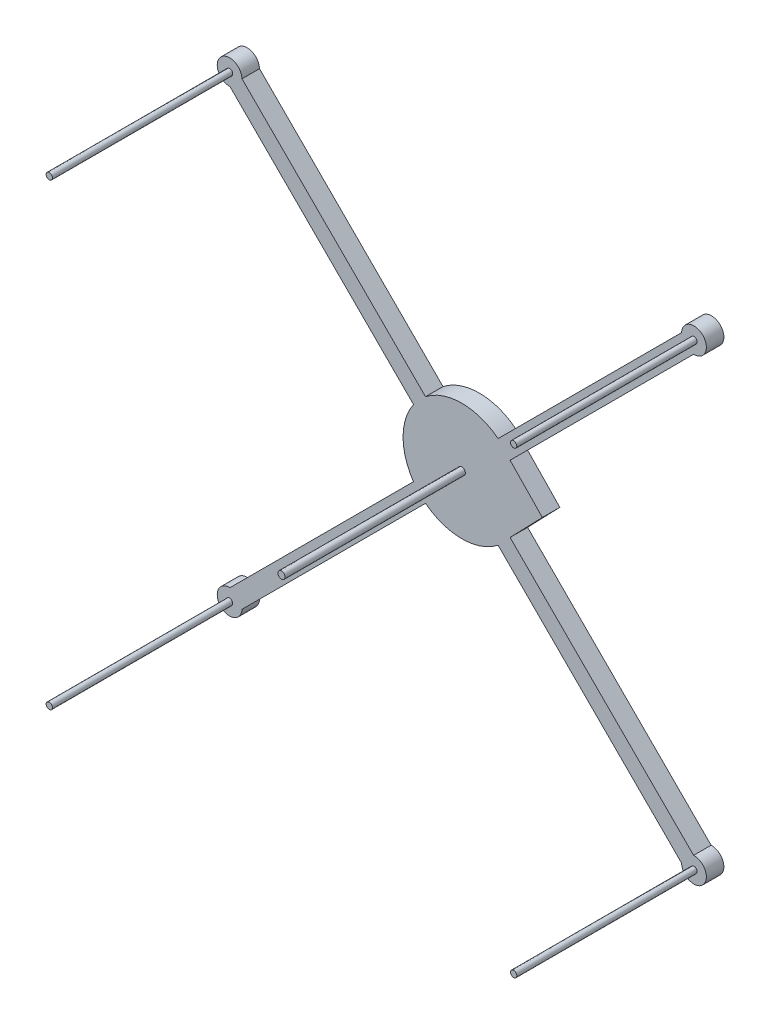
ISO-10303-21;
HEADER;
FILE_DESCRIPTION(('STEP AP214'),'2;1');
FILE_NAME('part.step','',(''),(''),'','','');
FILE_SCHEMA(('AUTOMOTIVE_DESIGN { 1 0 10303 214 1 1 1 1 }'));
ENDSEC;
DATA;
#1=APPLICATION_CONTEXT('core data for automotive mechanical design processes');
#2=APPLICATION_PROTOCOL_DEFINITION('international standard','automotive_design',2000,#1);
#3=PRODUCT_CONTEXT('',#1,'mechanical');
#4=PRODUCT('Part','Part','',(#3));
#5=PRODUCT_RELATED_PRODUCT_CATEGORY('part','',(#4));
#6=PRODUCT_DEFINITION_FORMATION('','',#4);
#7=PRODUCT_DEFINITION_CONTEXT('part definition',#1,'design');
#8=PRODUCT_DEFINITION('design','',#6,#7);
#9=PRODUCT_DEFINITION_SHAPE('','',#8);
#10=(LENGTH_UNIT() NAMED_UNIT(*) SI_UNIT(.MILLI.,.METRE.));
#11=(NAMED_UNIT(*) PLANE_ANGLE_UNIT() SI_UNIT($,.RADIAN.));
#12=(NAMED_UNIT(*) SI_UNIT($,.STERADIAN.) SOLID_ANGLE_UNIT());
#13=UNCERTAINTY_MEASURE_WITH_UNIT(LENGTH_MEASURE(1.E-05),#10,'distance_accuracy_value','');
#14=(GEOMETRIC_REPRESENTATION_CONTEXT(3) GLOBAL_UNCERTAINTY_ASSIGNED_CONTEXT((#13)) GLOBAL_UNIT_ASSIGNED_CONTEXT((#10,
#11,#12)) REPRESENTATION_CONTEXT('',''));
#15=CARTESIAN_POINT('',(0.,0.,0.));
#16=DIRECTION('',(0.,0.,1.));
#17=DIRECTION('',(1.,0.,0.));
#18=AXIS2_PLACEMENT_3D('',#15,#16,#17);
#19=CARTESIAN_POINT('',(0.,0.,10.));
#20=DIRECTION('',(0.,0.,-1.));
#21=DIRECTION('',(-1.,0.,0.));
#22=AXIS2_PLACEMENT_3D('',#19,#20,#21);
#23=CYLINDRICAL_SURFACE('',#22,33.5467251566115);
#24=CARTESIAN_POINT('',(0.,0.,0.));
#25=DIRECTION('',(0.,0.,1.));
#26=DIRECTION('',(1.,0.,0.));
#27=AXIS2_PLACEMENT_3D('',#24,#25,#26);
#28=CIRCLE('',#27,33.5467251566115);
#29=CARTESIAN_POINT('',(-27.5804067693425,19.0972231272203,0.));
#30=VERTEX_POINT('',#29);
#31=CARTESIAN_POINT('',(-27.5804067693425,-19.0972231272203,0.));
#32=VERTEX_POINT('',#31);
#33=EDGE_CURVE('E195',#30,#32,#28,.T.);
#34=ORIENTED_EDGE('',*,*,#33,.T.);
#35=DIRECTION('',(0.,0.,-1.));
#36=VECTOR('',#35,1.);
#37=CARTESIAN_POINT('',(-27.5804067693425,-19.0972231272203,10.));
#38=LINE('',#37,#36);
#39=CARTESIAN_POINT('',(-27.5804067693425,-19.0972231272203,10.));
#40=VERTEX_POINT('',#39);
#41=EDGE_CURVE('E13',#40,#32,#38,.T.);
#42=ORIENTED_EDGE('',*,*,#41,.F.);
#43=CARTESIAN_POINT('',(0.,0.,10.));
#44=DIRECTION('',(0.,0.,1.));
#45=DIRECTION('',(1.,0.,0.));
#46=AXIS2_PLACEMENT_3D('',#43,#44,#45);
#47=CIRCLE('',#46,33.5467251566115);
#48=CARTESIAN_POINT('',(-27.5804067693425,19.0972231272203,10.));
#49=VERTEX_POINT('',#48);
#50=EDGE_CURVE('E228',#49,#40,#47,.T.);
#51=ORIENTED_EDGE('',*,*,#50,.F.);
#52=DIRECTION('',(0.,0.,-1.));
#53=VECTOR('',#52,1.);
#54=CARTESIAN_POINT('',(-27.5804067693425,19.0972231272203,10.));
#55=LINE('',#54,#53);
#56=EDGE_CURVE('E191',#49,#30,#55,.T.);
#57=ORIENTED_EDGE('',*,*,#56,.T.);
#58=EDGE_LOOP('',(#34,#42,#51,#57));
#59=FACE_BOUND('',#58,.T.);
#60=ADVANCED_FACE('F45',(#59),#23,.T.);
#61=CARTESIAN_POINT('',(-27.5804067693425,-19.0972231272203,10.));
#62=DIRECTION('',(0.707106781186548,-0.707106781186548,0.));
#63=DIRECTION('',(0.707106781186548,0.707106781186548,0.));
#64=AXIS2_PLACEMENT_3D('',#61,#62,#63);
#65=PLANE('',#64);
#66=DIRECTION('',(-0.707106781186547,-0.707106781186547,0.));
#67=VECTOR('',#66,1.);
#68=CARTESIAN_POINT('',(-27.5804067693425,-19.0972231272203,0.));
#69=LINE('',#68,#67);
#70=CARTESIAN_POINT('',(-132.411700909868,-123.928517267745,0.));
#71=VERTEX_POINT('',#70);
#72=EDGE_CURVE('E198',#32,#71,#69,.T.);
#73=ORIENTED_EDGE('',*,*,#72,.T.);
#74=DIRECTION('',(0.,0.,-1.));
#75=VECTOR('',#74,1.);
#76=CARTESIAN_POINT('',(-132.411700909868,-123.928517267745,10.));
#77=LINE('',#76,#75);
#78=CARTESIAN_POINT('',(-132.411700909868,-123.928517267745,10.));
#79=VERTEX_POINT('',#78);
#80=EDGE_CURVE('E53',#79,#71,#77,.T.);
#81=ORIENTED_EDGE('',*,*,#80,.F.);
#82=DIRECTION('',(-0.707106781186547,-0.707106781186547,0.));
#83=VECTOR('',#82,1.);
#84=CARTESIAN_POINT('',(-27.5804067693425,-19.0972231272203,10.));
#85=LINE('',#84,#83);
#86=EDGE_CURVE('E131',#40,#79,#85,.T.);
#87=ORIENTED_EDGE('',*,*,#86,.F.);
#88=ORIENTED_EDGE('',*,*,#41,.T.);
#89=EDGE_LOOP('',(#73,#81,#87,#88));
#90=FACE_BOUND('',#89,.T.);
#91=ADVANCED_FACE('F332',(#90),#65,.F.);
#92=CARTESIAN_POINT('',(-132.621345525346,-130.996476600905,10.));
#93=DIRECTION('',(0.,0.,-1.));
#94=DIRECTION('',(-1.,0.,0.));
#95=AXIS2_PLACEMENT_3D('',#92,#93,#94);
#96=CYLINDRICAL_SURFACE('',#95,7.07106781186562);
#97=CARTESIAN_POINT('',(-132.621345525346,-130.996476600905,0.));
#98=DIRECTION('',(0.,0.,1.));
#99=DIRECTION('',(1.,0.,0.));
#100=AXIS2_PLACEMENT_3D('',#97,#98,#99);
#101=CIRCLE('',#100,7.07106781186562);
#102=CARTESIAN_POINT('',(-125.553579230032,-131.212531211641,0.));
#103=VERTEX_POINT('',#102);
#104=EDGE_CURVE('E201',#71,#103,#101,.T.);
#105=ORIENTED_EDGE('',*,*,#104,.T.);
#106=DIRECTION('',(0.,0.,-1.));
#107=VECTOR('',#106,1.);
#108=CARTESIAN_POINT('',(-125.553579230032,-131.212531211641,10.));
#109=LINE('',#108,#107);
#110=CARTESIAN_POINT('',(-125.553579230032,-131.212531211641,10.));
#111=VERTEX_POINT('',#110);
#112=EDGE_CURVE('E262',#111,#103,#109,.T.);
#113=ORIENTED_EDGE('',*,*,#112,.F.);
#114=CARTESIAN_POINT('',(-132.621345525346,-130.996476600905,10.));
#115=DIRECTION('',(0.,0.,1.));
#116=DIRECTION('',(1.,0.,0.));
#117=AXIS2_PLACEMENT_3D('',#114,#115,#116);
#118=CIRCLE('',#117,7.07106781186562);
#119=EDGE_CURVE('E270',#79,#111,#118,.T.);
#120=ORIENTED_EDGE('',*,*,#119,.F.);
#121=ORIENTED_EDGE('',*,*,#80,.T.);
#122=EDGE_LOOP('',(#105,#113,#120,#121));
#123=FACE_BOUND('',#122,.T.);
#124=ADVANCED_FACE('F268',(#123),#96,.T.);
#125=CARTESIAN_POINT('',(-20.7222850895072,-26.3812370711159,10.));
#126=DIRECTION('',(-0.707106781186549,0.707106781186546,0.));
#127=DIRECTION('',(-0.707106781186546,-0.707106781186549,0.));
#128=AXIS2_PLACEMENT_3D('',#125,#126,#127);
#129=PLANE('',#128);
#130=DIRECTION('',(0.707106781186546,0.707106781186549,0.));
#131=VECTOR('',#130,1.);
#132=CARTESIAN_POINT('',(-20.7222850895072,-26.3812370711159,0.));
#133=LINE('',#132,#131);
#134=CARTESIAN_POINT('',(-20.7222850895072,-26.3812370711159,0.));
#135=VERTEX_POINT('',#134);
#136=EDGE_CURVE('E203',#103,#135,#133,.T.);
#137=ORIENTED_EDGE('',*,*,#136,.T.);
#138=DIRECTION('',(0.,0.,-1.));
#139=VECTOR('',#138,1.);
#140=CARTESIAN_POINT('',(-20.7222850895072,-26.3812370711159,10.));
#141=LINE('',#140,#139);
#142=CARTESIAN_POINT('',(-20.7222850895072,-26.3812370711159,10.));
#143=VERTEX_POINT('',#142);
#144=EDGE_CURVE('E259',#143,#135,#141,.T.);
#145=ORIENTED_EDGE('',*,*,#144,.F.);
#146=DIRECTION('',(0.707106781186546,0.707106781186549,0.));
#147=VECTOR('',#146,1.);
#148=CARTESIAN_POINT('',(-20.7222850895072,-26.3812370711159,10.));
#149=LINE('',#148,#147);
#150=EDGE_CURVE('E288',#111,#143,#149,.T.);
#151=ORIENTED_EDGE('',*,*,#150,.F.);
#152=ORIENTED_EDGE('',*,*,#112,.T.);
#153=EDGE_LOOP('',(#137,#145,#151,#152));
#154=FACE_BOUND('',#153,.T.);
#155=ADVANCED_FACE('F279',(#154),#129,.F.);
#156=CARTESIAN_POINT('',(0.,0.,10.));
#157=DIRECTION('',(0.,0.,-1.));
#158=DIRECTION('',(-1.,0.,0.));
#159=AXIS2_PLACEMENT_3D('',#156,#157,#158);
#160=CYLINDRICAL_SURFACE('',#159,33.5467251566115);
#161=CARTESIAN_POINT('',(0.,0.,0.));
#162=DIRECTION('',(0.,0.,1.));
#163=DIRECTION('',(1.,0.,0.));
#164=AXIS2_PLACEMENT_3D('',#161,#162,#163);
#165=CIRCLE('',#164,33.5467251566115);
#166=CARTESIAN_POINT('',(20.7222850895072,-26.3812370711159,0.));
#167=VERTEX_POINT('',#166);
#168=EDGE_CURVE('E205',#135,#167,#165,.T.);
#169=ORIENTED_EDGE('',*,*,#168,.T.);
#170=DIRECTION('',(0.,0.,-1.));
#171=VECTOR('',#170,1.);
#172=CARTESIAN_POINT('',(20.7222850895072,-26.3812370711159,10.));
#173=LINE('',#172,#171);
#174=CARTESIAN_POINT('',(20.7222850895072,-26.3812370711159,10.));
#175=VERTEX_POINT('',#174);
#176=EDGE_CURVE('E256',#175,#167,#173,.T.);
#177=ORIENTED_EDGE('',*,*,#176,.F.);
#178=CARTESIAN_POINT('',(0.,0.,10.));
#179=DIRECTION('',(0.,0.,1.));
#180=DIRECTION('',(1.,0.,0.));
#181=AXIS2_PLACEMENT_3D('',#178,#179,#180);
#182=CIRCLE('',#181,33.5467251566115);
#183=EDGE_CURVE('E285',#143,#175,#182,.T.);
#184=ORIENTED_EDGE('',*,*,#183,.F.);
#185=ORIENTED_EDGE('',*,*,#144,.T.);
#186=EDGE_LOOP('',(#169,#177,#184,#185));
#187=FACE_BOUND('',#186,.T.);
#188=ADVANCED_FACE('F283',(#187),#160,.T.);
#189=CARTESIAN_POINT('',(20.7222850895072,-26.3812370711159,10.));
#190=DIRECTION('',(0.707106781186549,0.707106781186546,0.));
#191=DIRECTION('',(-0.707106781186546,0.707106781186549,0.));
#192=AXIS2_PLACEMENT_3D('',#189,#190,#191);
#193=PLANE('',#192);
#194=DIRECTION('',(0.707106781186546,-0.707106781186549,0.));
#195=VECTOR('',#194,1.);
#196=CARTESIAN_POINT('',(20.7222850895072,-26.3812370711159,0.));
#197=LINE('',#196,#195);
#198=CARTESIAN_POINT('',(125.553579230032,-131.212531211641,0.));
#199=VERTEX_POINT('',#198);
#200=EDGE_CURVE('E207',#167,#199,#197,.T.);
#201=ORIENTED_EDGE('',*,*,#200,.T.);
#202=DIRECTION('',(0.,0.,-1.));
#203=VECTOR('',#202,1.);
#204=CARTESIAN_POINT('',(125.553579230032,-131.212531211641,10.));
#205=LINE('',#204,#203);
#206=CARTESIAN_POINT('',(125.553579230032,-131.212531211641,10.));
#207=VERTEX_POINT('',#206);
#208=EDGE_CURVE('E253',#207,#199,#205,.T.);
#209=ORIENTED_EDGE('',*,*,#208,.F.);
#210=DIRECTION('',(0.707106781186546,-0.707106781186549,0.));
#211=VECTOR('',#210,1.);
#212=CARTESIAN_POINT('',(20.7222850895072,-26.3812370711159,10.));
#213=LINE('',#212,#211);
#214=EDGE_CURVE('E287',#175,#207,#213,.T.);
#215=ORIENTED_EDGE('',*,*,#214,.F.);
#216=ORIENTED_EDGE('',*,*,#176,.T.);
#217=EDGE_LOOP('',(#201,#209,#215,#216));
#218=FACE_BOUND('',#217,.T.);
#219=ADVANCED_FACE('F345',(#218),#193,.F.);
#220=CARTESIAN_POINT('',(132.621345525346,-130.996476600905,10.));
#221=DIRECTION('',(0.,0.,-1.));
#222=DIRECTION('',(-1.,0.,0.));
#223=AXIS2_PLACEMENT_3D('',#220,#221,#222);
#224=CYLINDRICAL_SURFACE('',#223,7.07106781186562);
#225=CARTESIAN_POINT('',(132.621345525346,-130.996476600905,0.));
#226=DIRECTION('',(0.,0.,1.));
#227=DIRECTION('',(-1.,0.,0.));
#228=AXIS2_PLACEMENT_3D('',#225,#226,#227);
#229=CIRCLE('',#228,7.07106781186562);
#230=CARTESIAN_POINT('',(132.411700909868,-123.928517267745,0.));
#231=VERTEX_POINT('',#230);
#232=EDGE_CURVE('E209',#199,#231,#229,.T.);
#233=ORIENTED_EDGE('',*,*,#232,.T.);
#234=DIRECTION('',(0.,0.,-1.));
#235=VECTOR('',#234,1.);
#236=CARTESIAN_POINT('',(132.411700909868,-123.928517267745,10.));
#237=LINE('',#236,#235);
#238=CARTESIAN_POINT('',(132.411700909868,-123.928517267745,10.));
#239=VERTEX_POINT('',#238);
#240=EDGE_CURVE('E250',#239,#231,#237,.T.);
#241=ORIENTED_EDGE('',*,*,#240,.F.);
#242=CARTESIAN_POINT('',(132.621345525346,-130.996476600905,10.));
#243=DIRECTION('',(0.,0.,1.));
#244=DIRECTION('',(-1.,0.,0.));
#245=AXIS2_PLACEMENT_3D('',#242,#243,#244);
#246=CIRCLE('',#245,7.07106781186562);
#247=EDGE_CURVE('E290',#207,#239,#246,.T.);
#248=ORIENTED_EDGE('',*,*,#247,.F.);
#249=ORIENTED_EDGE('',*,*,#208,.T.);
#250=EDGE_LOOP('',(#233,#241,#248,#249));
#251=FACE_BOUND('',#250,.T.);
#252=ADVANCED_FACE('F348',(#251),#224,.T.);
#253=CARTESIAN_POINT('',(27.5804067693425,-19.0972231272203,10.));
#254=DIRECTION('',(-0.707106781186548,-0.707106781186548,0.));
#255=DIRECTION('',(0.707106781186548,-0.707106781186548,0.));
#256=AXIS2_PLACEMENT_3D('',#253,#254,#255);
#257=PLANE('',#256);
#258=DIRECTION('',(-0.707106781186547,0.707106781186547,0.));
#259=VECTOR('',#258,1.);
#260=CARTESIAN_POINT('',(27.5804067693425,-19.0972231272203,0.));
#261=LINE('',#260,#259);
#262=CARTESIAN_POINT('',(27.5804067693425,-19.0972231272203,0.));
#263=VERTEX_POINT('',#262);
#264=EDGE_CURVE('E211',#231,#263,#261,.T.);
#265=ORIENTED_EDGE('',*,*,#264,.T.);
#266=DIRECTION('',(0.,0.,-1.));
#267=VECTOR('',#266,1.);
#268=CARTESIAN_POINT('',(27.5804067693425,-19.0972231272203,10.));
#269=LINE('',#268,#267);
#270=CARTESIAN_POINT('',(27.5804067693425,-19.0972231272203,10.));
#271=VERTEX_POINT('',#270);
#272=EDGE_CURVE('E247',#271,#263,#269,.T.);
#273=ORIENTED_EDGE('',*,*,#272,.F.);
#274=DIRECTION('',(-0.707106781186547,0.707106781186547,0.));
#275=VECTOR('',#274,1.);
#276=CARTESIAN_POINT('',(27.5804067693425,-19.0972231272203,10.));
#277=LINE('',#276,#275);
#278=EDGE_CURVE('E296',#239,#271,#277,.T.);
#279=ORIENTED_EDGE('',*,*,#278,.F.);
#280=ORIENTED_EDGE('',*,*,#240,.T.);
#281=EDGE_LOOP('',(#265,#273,#279,#280));
#282=FACE_BOUND('',#281,.T.);
#283=ADVANCED_FACE('F352',(#282),#257,.F.);
#284=CARTESIAN_POINT('',(46.0050037511092,0.,10.));
#285=DIRECTION('',(-0.719666942195826,0.694319445435967,0.));
#286=DIRECTION('',(-0.694319445435967,-0.719666942195826,0.));
#287=AXIS2_PLACEMENT_3D('',#284,#285,#286);
#288=PLANE('',#287);
#289=DIRECTION('',(0.694319445435967,0.719666942195827,0.));
#290=VECTOR('',#289,1.);
#291=CARTESIAN_POINT('',(46.0050037511092,0.,0.));
#292=LINE('',#291,#290);
#293=CARTESIAN_POINT('',(46.0050037511092,0.,0.));
#294=VERTEX_POINT('',#293);
#295=EDGE_CURVE('E213',#263,#294,#292,.T.);
#296=ORIENTED_EDGE('',*,*,#295,.T.);
#297=DIRECTION('',(0.,0.,-1.));
#298=VECTOR('',#297,1.);
#299=CARTESIAN_POINT('',(46.0050037511092,0.,10.));
#300=LINE('',#299,#298);
#301=CARTESIAN_POINT('',(46.0050037511092,0.,10.));
#302=VERTEX_POINT('',#301);
#303=EDGE_CURVE('E244',#302,#294,#300,.T.);
#304=ORIENTED_EDGE('',*,*,#303,.F.);
#305=DIRECTION('',(0.694319445435967,0.719666942195827,0.));
#306=VECTOR('',#305,1.);
#307=CARTESIAN_POINT('',(46.0050037511092,0.,10.));
#308=LINE('',#307,#306);
#309=EDGE_CURVE('E298',#271,#302,#308,.T.);
#310=ORIENTED_EDGE('',*,*,#309,.F.);
#311=ORIENTED_EDGE('',*,*,#272,.T.);
#312=EDGE_LOOP('',(#296,#304,#310,#311));
#313=FACE_BOUND('',#312,.T.);
#314=ADVANCED_FACE('F356',(#313),#288,.F.);
#315=CARTESIAN_POINT('',(27.5804067693425,19.0972231272203,10.));
#316=DIRECTION('',(-0.719666942195826,-0.694319445435967,0.));
#317=DIRECTION('',(0.694319445435967,-0.719666942195826,0.));
#318=AXIS2_PLACEMENT_3D('',#315,#316,#317);
#319=PLANE('',#318);
#320=DIRECTION('',(-0.694319445435967,0.719666942195827,0.));
#321=VECTOR('',#320,1.);
#322=CARTESIAN_POINT('',(27.5804067693425,19.0972231272203,0.));
#323=LINE('',#322,#321);
#324=CARTESIAN_POINT('',(27.5804067693425,19.0972231272203,0.));
#325=VERTEX_POINT('',#324);
#326=EDGE_CURVE('E215',#294,#325,#323,.T.);
#327=ORIENTED_EDGE('',*,*,#326,.T.);
#328=DIRECTION('',(0.,0.,-1.));
#329=VECTOR('',#328,1.);
#330=CARTESIAN_POINT('',(27.5804067693425,19.0972231272203,10.));
#331=LINE('',#330,#329);
#332=CARTESIAN_POINT('',(27.5804067693425,19.0972231272203,10.));
#333=VERTEX_POINT('',#332);
#334=EDGE_CURVE('E241',#333,#325,#331,.T.);
#335=ORIENTED_EDGE('',*,*,#334,.F.);
#336=DIRECTION('',(-0.694319445435967,0.719666942195827,0.));
#337=VECTOR('',#336,1.);
#338=CARTESIAN_POINT('',(27.5804067693425,19.0972231272203,10.));
#339=LINE('',#338,#337);
#340=EDGE_CURVE('E300',#302,#333,#339,.T.);
#341=ORIENTED_EDGE('',*,*,#340,.F.);
#342=ORIENTED_EDGE('',*,*,#303,.T.);
#343=EDGE_LOOP('',(#327,#335,#341,#342));
#344=FACE_BOUND('',#343,.T.);
#345=ADVANCED_FACE('F360',(#344),#319,.F.);
#346=CARTESIAN_POINT('',(27.5804067693425,19.0972231272203,10.));
#347=DIRECTION('',(-0.707106781186548,0.707106781186548,0.));
#348=DIRECTION('',(-0.707106781186548,-0.707106781186548,0.));
#349=AXIS2_PLACEMENT_3D('',#346,#347,#348);
#350=PLANE('',#349);
#351=DIRECTION('',(0.707106781186547,0.707106781186547,0.));
#352=VECTOR('',#351,1.);
#353=CARTESIAN_POINT('',(27.5804067693425,19.0972231272203,0.));
#354=LINE('',#353,#352);
#355=CARTESIAN_POINT('',(132.411700909868,123.928517267745,0.));
#356=VERTEX_POINT('',#355);
#357=EDGE_CURVE('E217',#325,#356,#354,.T.);
#358=ORIENTED_EDGE('',*,*,#357,.T.);
#359=DIRECTION('',(0.,0.,-1.));
#360=VECTOR('',#359,1.);
#361=CARTESIAN_POINT('',(132.411700909868,123.928517267745,10.));
#362=LINE('',#361,#360);
#363=CARTESIAN_POINT('',(132.411700909868,123.928517267745,10.));
#364=VERTEX_POINT('',#363);
#365=EDGE_CURVE('E238',#364,#356,#362,.T.);
#366=ORIENTED_EDGE('',*,*,#365,.F.);
#367=DIRECTION('',(0.707106781186547,0.707106781186547,0.));
#368=VECTOR('',#367,1.);
#369=CARTESIAN_POINT('',(27.5804067693425,19.0972231272203,10.));
#370=LINE('',#369,#368);
#371=EDGE_CURVE('E302',#333,#364,#370,.T.);
#372=ORIENTED_EDGE('',*,*,#371,.F.);
#373=ORIENTED_EDGE('',*,*,#334,.T.);
#374=EDGE_LOOP('',(#358,#366,#372,#373));
#375=FACE_BOUND('',#374,.T.);
#376=ADVANCED_FACE('F364',(#375),#350,.F.);
#377=CARTESIAN_POINT('',(132.621345525346,130.996476600905,10.));
#378=DIRECTION('',(0.,0.,-1.));
#379=DIRECTION('',(-1.,0.,0.));
#380=AXIS2_PLACEMENT_3D('',#377,#378,#379);
#381=CYLINDRICAL_SURFACE('',#380,7.07106781186562);
#382=CARTESIAN_POINT('',(132.621345525346,130.996476600905,0.));
#383=DIRECTION('',(0.,0.,1.));
#384=DIRECTION('',(1.,0.,0.));
#385=AXIS2_PLACEMENT_3D('',#382,#383,#384);
#386=CIRCLE('',#385,7.07106781186562);
#387=CARTESIAN_POINT('',(125.553579230032,131.212531211641,0.));
#388=VERTEX_POINT('',#387);
#389=EDGE_CURVE('E219',#356,#388,#386,.T.);
#390=ORIENTED_EDGE('',*,*,#389,.T.);
#391=DIRECTION('',(0.,0.,-1.));
#392=VECTOR('',#391,1.);
#393=CARTESIAN_POINT('',(125.553579230032,131.212531211641,10.));
#394=LINE('',#393,#392);
#395=CARTESIAN_POINT('',(125.553579230032,131.212531211641,10.));
#396=VERTEX_POINT('',#395);
#397=EDGE_CURVE('E235',#396,#388,#394,.T.);
#398=ORIENTED_EDGE('',*,*,#397,.F.);
#399=CARTESIAN_POINT('',(132.621345525346,130.996476600905,10.));
#400=DIRECTION('',(0.,0.,1.));
#401=DIRECTION('',(1.,0.,0.));
#402=AXIS2_PLACEMENT_3D('',#399,#400,#401);
#403=CIRCLE('',#402,7.07106781186562);
#404=EDGE_CURVE('E304',#364,#396,#403,.T.);
#405=ORIENTED_EDGE('',*,*,#404,.F.);
#406=ORIENTED_EDGE('',*,*,#365,.T.);
#407=EDGE_LOOP('',(#390,#398,#405,#406));
#408=FACE_BOUND('',#407,.T.);
#409=ADVANCED_FACE('F368',(#408),#381,.T.);
#410=CARTESIAN_POINT('',(20.7222850895072,26.3812370711159,10.));
#411=DIRECTION('',(0.707106781186549,-0.707106781186546,0.));
#412=DIRECTION('',(0.707106781186546,0.707106781186549,0.));
#413=AXIS2_PLACEMENT_3D('',#410,#411,#412);
#414=PLANE('',#413);
#415=DIRECTION('',(-0.707106781186546,-0.707106781186549,0.));
#416=VECTOR('',#415,1.);
#417=CARTESIAN_POINT('',(20.7222850895072,26.3812370711159,0.));
#418=LINE('',#417,#416);
#419=CARTESIAN_POINT('',(20.7222850895072,26.3812370711159,0.));
#420=VERTEX_POINT('',#419);
#421=EDGE_CURVE('E221',#388,#420,#418,.T.);
#422=ORIENTED_EDGE('',*,*,#421,.T.);
#423=DIRECTION('',(0.,0.,-1.));
#424=VECTOR('',#423,1.);
#425=CARTESIAN_POINT('',(20.7222850895072,26.3812370711159,10.));
#426=LINE('',#425,#424);
#427=CARTESIAN_POINT('',(20.7222850895072,26.3812370711159,10.));
#428=VERTEX_POINT('',#427);
#429=EDGE_CURVE('E232',#428,#420,#426,.T.);
#430=ORIENTED_EDGE('',*,*,#429,.F.);
#431=DIRECTION('',(-0.707106781186546,-0.707106781186549,0.));
#432=VECTOR('',#431,1.);
#433=CARTESIAN_POINT('',(20.7222850895072,26.3812370711159,10.));
#434=LINE('',#433,#432);
#435=EDGE_CURVE('E306',#396,#428,#434,.T.);
#436=ORIENTED_EDGE('',*,*,#435,.F.);
#437=ORIENTED_EDGE('',*,*,#397,.T.);
#438=EDGE_LOOP('',(#422,#430,#436,#437));
#439=FACE_BOUND('',#438,.T.);
#440=ADVANCED_FACE('F312',(#439),#414,.F.);
#441=CARTESIAN_POINT('',(0.,0.,10.));
#442=DIRECTION('',(0.,0.,-1.));
#443=DIRECTION('',(-1.,0.,0.));
#444=AXIS2_PLACEMENT_3D('',#441,#442,#443);
#445=CYLINDRICAL_SURFACE('',#444,33.5467251566115);
#446=CARTESIAN_POINT('',(0.,0.,0.));
#447=DIRECTION('',(0.,0.,1.));
#448=DIRECTION('',(-1.,0.,0.));
#449=AXIS2_PLACEMENT_3D('',#446,#447,#448);
#450=CIRCLE('',#449,33.5467251566115);
#451=CARTESIAN_POINT('',(-20.7222850895072,26.3812370711159,0.));
#452=VERTEX_POINT('',#451);
#453=EDGE_CURVE('E223',#420,#452,#450,.T.);
#454=ORIENTED_EDGE('',*,*,#453,.T.);
#455=DIRECTION('',(0.,0.,-1.));
#456=VECTOR('',#455,1.);
#457=CARTESIAN_POINT('',(-20.7222850895072,26.3812370711159,10.));
#458=LINE('',#457,#456);
#459=CARTESIAN_POINT('',(-20.7222850895072,26.3812370711159,10.));
#460=VERTEX_POINT('',#459);
#461=EDGE_CURVE('E186',#460,#452,#458,.T.);
#462=ORIENTED_EDGE('',*,*,#461,.F.);
#463=CARTESIAN_POINT('',(0.,0.,10.));
#464=DIRECTION('',(0.,0.,1.));
#465=DIRECTION('',(-1.,0.,0.));
#466=AXIS2_PLACEMENT_3D('',#463,#464,#465);
#467=CIRCLE('',#466,33.5467251566115);
#468=EDGE_CURVE('E177',#428,#460,#467,.T.);
#469=ORIENTED_EDGE('',*,*,#468,.F.);
#470=ORIENTED_EDGE('',*,*,#429,.T.);
#471=EDGE_LOOP('',(#454,#462,#469,#470));
#472=FACE_BOUND('',#471,.T.);
#473=ADVANCED_FACE('F316',(#472),#445,.T.);
#474=CARTESIAN_POINT('',(-20.7222850895072,26.3812370711159,10.));
#475=DIRECTION('',(-0.707106781186549,-0.707106781186546,0.));
#476=DIRECTION('',(0.707106781186546,-0.707106781186549,0.));
#477=AXIS2_PLACEMENT_3D('',#474,#475,#476);
#478=PLANE('',#477);
#479=DIRECTION('',(-0.707106781186546,0.707106781186549,0.));
#480=VECTOR('',#479,1.);
#481=CARTESIAN_POINT('',(-20.7222850895072,26.3812370711159,0.));
#482=LINE('',#481,#480);
#483=CARTESIAN_POINT('',(-125.553579230032,131.212531211641,0.));
#484=VERTEX_POINT('',#483);
#485=EDGE_CURVE('E185',#452,#484,#482,.T.);
#486=ORIENTED_EDGE('',*,*,#485,.T.);
#487=DIRECTION('',(0.,0.,-1.));
#488=VECTOR('',#487,1.);
#489=CARTESIAN_POINT('',(-125.553579230032,131.212531211641,10.));
#490=LINE('',#489,#488);
#491=CARTESIAN_POINT('',(-125.553579230032,131.212531211641,10.));
#492=VERTEX_POINT('',#491);
#493=EDGE_CURVE('E182',#492,#484,#490,.T.);
#494=ORIENTED_EDGE('',*,*,#493,.F.);
#495=DIRECTION('',(-0.707106781186546,0.707106781186549,0.));
#496=VECTOR('',#495,1.);
#497=CARTESIAN_POINT('',(-20.7222850895072,26.3812370711159,10.));
#498=LINE('',#497,#496);
#499=EDGE_CURVE('E171',#460,#492,#498,.T.);
#500=ORIENTED_EDGE('',*,*,#499,.F.);
#501=ORIENTED_EDGE('',*,*,#461,.T.);
#502=EDGE_LOOP('',(#486,#494,#500,#501));
#503=FACE_BOUND('',#502,.T.);
#504=ADVANCED_FACE('F183',(#503),#478,.F.);
#505=CARTESIAN_POINT('',(-132.621345525346,130.996476600905,10.));
#506=DIRECTION('',(0.,0.,-1.));
#507=DIRECTION('',(-1.,0.,0.));
#508=AXIS2_PLACEMENT_3D('',#505,#506,#507);
#509=CYLINDRICAL_SURFACE('',#508,7.07106781186562);
#510=CARTESIAN_POINT('',(-132.621345525346,130.996476600905,0.));
#511=DIRECTION('',(0.,0.,1.));
#512=DIRECTION('',(-1.,0.,0.));
#513=AXIS2_PLACEMENT_3D('',#510,#511,#512);
#514=CIRCLE('',#513,7.07106781186562);
#515=CARTESIAN_POINT('',(-132.411700909868,123.928517267745,0.));
#516=VERTEX_POINT('',#515);
#517=EDGE_CURVE('E117',#484,#516,#514,.T.);
#518=ORIENTED_EDGE('',*,*,#517,.T.);
#519=DIRECTION('',(0.,0.,-1.));
#520=VECTOR('',#519,1.);
#521=CARTESIAN_POINT('',(-132.411700909868,123.928517267745,10.));
#522=LINE('',#521,#520);
#523=CARTESIAN_POINT('',(-132.411700909868,123.928517267745,10.));
#524=VERTEX_POINT('',#523);
#525=EDGE_CURVE('E187',#524,#516,#522,.T.);
#526=ORIENTED_EDGE('',*,*,#525,.F.);
#527=CARTESIAN_POINT('',(-132.621345525346,130.996476600905,10.));
#528=DIRECTION('',(0.,0.,1.));
#529=DIRECTION('',(-1.,0.,0.));
#530=AXIS2_PLACEMENT_3D('',#527,#528,#529);
#531=CIRCLE('',#530,7.07106781186562);
#532=EDGE_CURVE('E175',#492,#524,#531,.T.);
#533=ORIENTED_EDGE('',*,*,#532,.F.);
#534=ORIENTED_EDGE('',*,*,#493,.T.);
#535=EDGE_LOOP('',(#518,#526,#533,#534));
#536=FACE_BOUND('',#535,.T.);
#537=ADVANCED_FACE('F189',(#536),#509,.T.);
#538=CARTESIAN_POINT('',(-27.5804067693425,19.0972231272203,10.));
#539=DIRECTION('',(0.707106781186548,0.707106781186548,0.));
#540=DIRECTION('',(-0.707106781186548,0.707106781186548,0.));
#541=AXIS2_PLACEMENT_3D('',#538,#539,#540);
#542=PLANE('',#541);
#543=DIRECTION('',(0.707106781186547,-0.707106781186547,0.));
#544=VECTOR('',#543,1.);
#545=CARTESIAN_POINT('',(-27.5804067693425,19.0972231272203,0.));
#546=LINE('',#545,#544);
#547=EDGE_CURVE('E123',#516,#30,#546,.T.);
#548=ORIENTED_EDGE('',*,*,#547,.T.);
#549=ORIENTED_EDGE('',*,*,#56,.F.);
#550=DIRECTION('',(0.707106781186547,-0.707106781186547,0.));
#551=VECTOR('',#550,1.);
#552=CARTESIAN_POINT('',(-27.5804067693425,19.0972231272203,10.));
#553=LINE('',#552,#551);
#554=EDGE_CURVE('E61',#524,#49,#553,.T.);
#555=ORIENTED_EDGE('',*,*,#554,.F.);
#556=ORIENTED_EDGE('',*,*,#525,.T.);
#557=EDGE_LOOP('',(#548,#549,#555,#556));
#558=FACE_BOUND('',#557,.T.);
#559=ADVANCED_FACE('F320',(#558),#542,.F.);
#560=CARTESIAN_POINT('',(0.,0.,10.));
#561=DIRECTION('',(0.,0.,1.));
#562=DIRECTION('',(1.,0.,0.));
#563=AXIS2_PLACEMENT_3D('',#560,#561,#562);
#564=PLANE('',#563);
#565=CARTESIAN_POINT('',(0.,0.,9.99999999999999));
#566=DIRECTION('',(0.,0.,1.));
#567=DIRECTION('',(1.,0.,0.));
#568=AXIS2_PLACEMENT_3D('',#565,#566,#567);
#569=CIRCLE('',#568,2.03870430125724);
#570=CARTESIAN_POINT('',(2.03870430125724,0.,9.99999999999999));
#571=VERTEX_POINT('',#570);
#572=EDGE_CURVE('E511',#571,#571,#569,.F.);
#573=ORIENTED_EDGE('',*,*,#572,.T.);
#574=EDGE_LOOP('',(#573));
#575=FACE_BOUND('',#574,.T.);
#576=CARTESIAN_POINT('',(-132.621345525346,-130.996476600905,9.99999999999999));
#577=DIRECTION('',(0.,0.,1.));
#578=DIRECTION('',(1.,0.,0.));
#579=AXIS2_PLACEMENT_3D('',#576,#577,#578);
#580=CIRCLE('',#579,1.79688562741758);
#581=CARTESIAN_POINT('',(-130.824459897929,-130.996476600905,9.99999999999999));
#582=VERTEX_POINT('',#581);
#583=EDGE_CURVE('E519',#582,#582,#580,.F.);
#584=ORIENTED_EDGE('',*,*,#583,.T.);
#585=EDGE_LOOP('',(#584));
#586=FACE_BOUND('',#585,.T.);
#587=CARTESIAN_POINT('',(132.621345525346,-130.996476600905,9.99999999999999));
#588=DIRECTION('',(0.,0.,1.));
#589=DIRECTION('',(1.,0.,0.));
#590=AXIS2_PLACEMENT_3D('',#587,#588,#589);
#591=CIRCLE('',#590,1.79688562741758);
#592=CARTESIAN_POINT('',(134.418231152764,-130.996476600905,9.99999999999999));
#593=VERTEX_POINT('',#592);
#594=EDGE_CURVE('E525',#593,#593,#591,.F.);
#595=ORIENTED_EDGE('',*,*,#594,.T.);
#596=EDGE_LOOP('',(#595));
#597=FACE_BOUND('',#596,.T.);
#598=CARTESIAN_POINT('',(132.621345525346,130.996476600905,9.99999999999999));
#599=DIRECTION('',(0.,0.,1.));
#600=DIRECTION('',(1.,0.,0.));
#601=AXIS2_PLACEMENT_3D('',#598,#599,#600);
#602=CIRCLE('',#601,1.79688562741758);
#603=CARTESIAN_POINT('',(134.418231152764,130.996476600905,9.99999999999999));
#604=VERTEX_POINT('',#603);
#605=EDGE_CURVE('E531',#604,#604,#602,.F.);
#606=ORIENTED_EDGE('',*,*,#605,.T.);
#607=EDGE_LOOP('',(#606));
#608=FACE_BOUND('',#607,.T.);
#609=CARTESIAN_POINT('',(-132.621345525346,130.996476600905,9.99999999999999));
#610=DIRECTION('',(0.,0.,1.));
#611=DIRECTION('',(1.,0.,0.));
#612=AXIS2_PLACEMENT_3D('',#609,#610,#611);
#613=CIRCLE('',#612,1.79688562741758);
#614=CARTESIAN_POINT('',(-130.824459897929,130.996476600905,9.99999999999999));
#615=VERTEX_POINT('',#614);
#616=EDGE_CURVE('E199',#615,#615,#613,.F.);
#617=ORIENTED_EDGE('',*,*,#616,.T.);
#618=EDGE_LOOP('',(#617));
#619=FACE_BOUND('',#618,.T.);
#620=ORIENTED_EDGE('',*,*,#50,.T.);
#621=ORIENTED_EDGE('',*,*,#86,.T.);
#622=ORIENTED_EDGE('',*,*,#119,.T.);
#623=ORIENTED_EDGE('',*,*,#150,.T.);
#624=ORIENTED_EDGE('',*,*,#183,.T.);
#625=ORIENTED_EDGE('',*,*,#214,.T.);
#626=ORIENTED_EDGE('',*,*,#247,.T.);
#627=ORIENTED_EDGE('',*,*,#278,.T.);
#628=ORIENTED_EDGE('',*,*,#309,.T.);
#629=ORIENTED_EDGE('',*,*,#340,.T.);
#630=ORIENTED_EDGE('',*,*,#371,.T.);
#631=ORIENTED_EDGE('',*,*,#404,.T.);
#632=ORIENTED_EDGE('',*,*,#435,.T.);
#633=ORIENTED_EDGE('',*,*,#468,.T.);
#634=ORIENTED_EDGE('',*,*,#499,.T.);
#635=ORIENTED_EDGE('',*,*,#532,.T.);
#636=ORIENTED_EDGE('',*,*,#554,.T.);
#637=EDGE_LOOP('',(#620,#621,#622,#623,#624,#625,#626,#627,#628,#629,#630,#631,#632,#633,#634,
#635,#636));
#638=FACE_BOUND('',#637,.T.);
#639=ADVANCED_FACE('F173',(#575,#586,#597,#608,#619,#638),#564,.T.);
#640=CARTESIAN_POINT('',(0.,0.,0.));
#641=DIRECTION('',(0.,0.,1.));
#642=DIRECTION('',(1.,0.,0.));
#643=AXIS2_PLACEMENT_3D('',#640,#641,#642);
#644=PLANE('',#643);
#645=ORIENTED_EDGE('',*,*,#33,.F.);
#646=ORIENTED_EDGE('',*,*,#547,.F.);
#647=ORIENTED_EDGE('',*,*,#517,.F.);
#648=ORIENTED_EDGE('',*,*,#485,.F.);
#649=ORIENTED_EDGE('',*,*,#453,.F.);
#650=ORIENTED_EDGE('',*,*,#421,.F.);
#651=ORIENTED_EDGE('',*,*,#389,.F.);
#652=ORIENTED_EDGE('',*,*,#357,.F.);
#653=ORIENTED_EDGE('',*,*,#326,.F.);
#654=ORIENTED_EDGE('',*,*,#295,.F.);
#655=ORIENTED_EDGE('',*,*,#264,.F.);
#656=ORIENTED_EDGE('',*,*,#232,.F.);
#657=ORIENTED_EDGE('',*,*,#200,.F.);
#658=ORIENTED_EDGE('',*,*,#168,.F.);
#659=ORIENTED_EDGE('',*,*,#136,.F.);
#660=ORIENTED_EDGE('',*,*,#104,.F.);
#661=ORIENTED_EDGE('',*,*,#72,.F.);
#662=EDGE_LOOP('',(#645,#646,#647,#648,#649,#650,#651,#652,#653,#654,#655,#656,#657,#658,#659,
#660,#661));
#663=FACE_BOUND('',#662,.T.);
#664=ADVANCED_FACE('F274',(#663),#644,.F.);
#665=CARTESIAN_POINT('',(-132.621345525346,130.996476600905,113.));
#666=DIRECTION('',(0.,0.,-1.));
#667=DIRECTION('',(-1.,0.,0.));
#668=AXIS2_PLACEMENT_3D('',#665,#666,#667);
#669=CYLINDRICAL_SURFACE('',#668,1.79688562741758);
#670=ORIENTED_EDGE('',*,*,#616,.F.);
#671=EDGE_LOOP('',(#670));
#672=FACE_BOUND('',#671,.T.);
#673=CARTESIAN_POINT('',(-132.621345525346,130.996476600905,113.));
#674=DIRECTION('',(0.,0.,1.));
#675=DIRECTION('',(1.,0.,0.));
#676=AXIS2_PLACEMENT_3D('',#673,#674,#675);
#677=CIRCLE('',#676,1.79688562741758);
#678=CARTESIAN_POINT('',(-130.824459897929,130.996476600905,113.));
#679=VERTEX_POINT('',#678);
#680=EDGE_CURVE('E534',#679,#679,#677,.T.);
#681=ORIENTED_EDGE('',*,*,#680,.F.);
#682=EDGE_LOOP('',(#681));
#683=FACE_BOUND('',#682,.T.);
#684=ADVANCED_FACE('F405',(#672,#683),#669,.T.);
#685=CARTESIAN_POINT('',(-132.621345525346,130.996476600905,113.));
#686=DIRECTION('',(0.,0.,1.));
#687=DIRECTION('',(1.,0.,0.));
#688=AXIS2_PLACEMENT_3D('',#685,#686,#687);
#689=PLANE('',#688);
#690=ORIENTED_EDGE('',*,*,#680,.T.);
#691=EDGE_LOOP('',(#690));
#692=FACE_BOUND('',#691,.T.);
#693=ADVANCED_FACE('F413',(#692),#689,.T.);
#694=CARTESIAN_POINT('',(132.621345525346,130.996476600905,113.));
#695=DIRECTION('',(0.,0.,-1.));
#696=DIRECTION('',(-1.,0.,0.));
#697=AXIS2_PLACEMENT_3D('',#694,#695,#696);
#698=CYLINDRICAL_SURFACE('',#697,1.79688562741758);
#699=ORIENTED_EDGE('',*,*,#605,.F.);
#700=EDGE_LOOP('',(#699));
#701=FACE_BOUND('',#700,.T.);
#702=CARTESIAN_POINT('',(132.621345525346,130.996476600905,113.));
#703=DIRECTION('',(0.,0.,1.));
#704=DIRECTION('',(-1.,0.,0.));
#705=AXIS2_PLACEMENT_3D('',#702,#703,#704);
#706=CIRCLE('',#705,1.79688562741758);
#707=CARTESIAN_POINT('',(130.824459897929,130.996476600905,113.));
#708=VERTEX_POINT('',#707);
#709=EDGE_CURVE('E528',#708,#708,#706,.T.);
#710=ORIENTED_EDGE('',*,*,#709,.F.);
#711=EDGE_LOOP('',(#710));
#712=FACE_BOUND('',#711,.T.);
#713=ADVANCED_FACE('F423',(#701,#712),#698,.T.);
#714=CARTESIAN_POINT('',(132.621345525346,130.996476600905,113.));
#715=DIRECTION('',(0.,0.,-1.));
#716=DIRECTION('',(-1.,0.,0.));
#717=AXIS2_PLACEMENT_3D('',#714,#715,#716);
#718=PLANE('',#717);
#719=ORIENTED_EDGE('',*,*,#709,.T.);
#720=EDGE_LOOP('',(#719));
#721=FACE_BOUND('',#720,.T.);
#722=ADVANCED_FACE('F433',(#721),#718,.F.);
#723=CARTESIAN_POINT('',(132.621345525346,-130.996476600905,113.));
#724=DIRECTION('',(0.,0.,-1.));
#725=DIRECTION('',(-1.,0.,0.));
#726=AXIS2_PLACEMENT_3D('',#723,#724,#725);
#727=CYLINDRICAL_SURFACE('',#726,1.79688562741758);
#728=ORIENTED_EDGE('',*,*,#594,.F.);
#729=EDGE_LOOP('',(#728));
#730=FACE_BOUND('',#729,.T.);
#731=CARTESIAN_POINT('',(132.621345525346,-130.996476600905,113.));
#732=DIRECTION('',(0.,0.,1.));
#733=DIRECTION('',(1.,0.,0.));
#734=AXIS2_PLACEMENT_3D('',#731,#732,#733);
#735=CIRCLE('',#734,1.79688562741758);
#736=CARTESIAN_POINT('',(134.418231152764,-130.996476600905,113.));
#737=VERTEX_POINT('',#736);
#738=EDGE_CURVE('E522',#737,#737,#735,.T.);
#739=ORIENTED_EDGE('',*,*,#738,.F.);
#740=EDGE_LOOP('',(#739));
#741=FACE_BOUND('',#740,.T.);
#742=ADVANCED_FACE('F443',(#730,#741),#727,.T.);
#743=CARTESIAN_POINT('',(132.621345525346,-130.996476600905,113.));
#744=DIRECTION('',(0.,0.,1.));
#745=DIRECTION('',(1.,0.,0.));
#746=AXIS2_PLACEMENT_3D('',#743,#744,#745);
#747=PLANE('',#746);
#748=ORIENTED_EDGE('',*,*,#738,.T.);
#749=EDGE_LOOP('',(#748));
#750=FACE_BOUND('',#749,.T.);
#751=ADVANCED_FACE('F453',(#750),#747,.T.);
#752=CARTESIAN_POINT('',(-132.621345525346,-130.996476600905,113.));
#753=DIRECTION('',(0.,0.,-1.));
#754=DIRECTION('',(-1.,0.,0.));
#755=AXIS2_PLACEMENT_3D('',#752,#753,#754);
#756=CYLINDRICAL_SURFACE('',#755,1.79688562741758);
#757=ORIENTED_EDGE('',*,*,#583,.F.);
#758=EDGE_LOOP('',(#757));
#759=FACE_BOUND('',#758,.T.);
#760=CARTESIAN_POINT('',(-132.621345525346,-130.996476600905,113.));
#761=DIRECTION('',(0.,0.,1.));
#762=DIRECTION('',(-1.,0.,0.));
#763=AXIS2_PLACEMENT_3D('',#760,#761,#762);
#764=CIRCLE('',#763,1.79688562741758);
#765=CARTESIAN_POINT('',(-134.418231152764,-130.996476600905,113.));
#766=VERTEX_POINT('',#765);
#767=EDGE_CURVE('E514',#766,#766,#764,.T.);
#768=ORIENTED_EDGE('',*,*,#767,.F.);
#769=EDGE_LOOP('',(#768));
#770=FACE_BOUND('',#769,.T.);
#771=ADVANCED_FACE('F463',(#759,#770),#756,.T.);
#772=CARTESIAN_POINT('',(-132.621345525346,-130.996476600905,113.));
#773=DIRECTION('',(0.,0.,-1.));
#774=DIRECTION('',(-1.,0.,0.));
#775=AXIS2_PLACEMENT_3D('',#772,#773,#774);
#776=PLANE('',#775);
#777=ORIENTED_EDGE('',*,*,#767,.T.);
#778=EDGE_LOOP('',(#777));
#779=FACE_BOUND('',#778,.T.);
#780=ADVANCED_FACE('F473',(#779),#776,.F.);
#781=CARTESIAN_POINT('',(0.,0.,113.));
#782=DIRECTION('',(0.,0.,-1.));
#783=DIRECTION('',(-1.,0.,0.));
#784=AXIS2_PLACEMENT_3D('',#781,#782,#783);
#785=CYLINDRICAL_SURFACE('',#784,2.03870430125724);
#786=ORIENTED_EDGE('',*,*,#572,.F.);
#787=EDGE_LOOP('',(#786));
#788=FACE_BOUND('',#787,.T.);
#789=CARTESIAN_POINT('',(0.,0.,113.));
#790=DIRECTION('',(0.,0.,1.));
#791=DIRECTION('',(1.,0.,0.));
#792=AXIS2_PLACEMENT_3D('',#789,#790,#791);
#793=CIRCLE('',#792,2.03870430125724);
#794=CARTESIAN_POINT('',(2.03870430125724,0.,113.));
#795=VERTEX_POINT('',#794);
#796=EDGE_CURVE('E509',#795,#795,#793,.T.);
#797=ORIENTED_EDGE('',*,*,#796,.F.);
#798=EDGE_LOOP('',(#797));
#799=FACE_BOUND('',#798,.T.);
#800=ADVANCED_FACE('F483',(#788,#799),#785,.T.);
#801=CARTESIAN_POINT('',(0.,0.,113.));
#802=DIRECTION('',(0.,0.,1.));
#803=DIRECTION('',(1.,0.,0.));
#804=AXIS2_PLACEMENT_3D('',#801,#802,#803);
#805=PLANE('',#804);
#806=ORIENTED_EDGE('',*,*,#796,.T.);
#807=EDGE_LOOP('',(#806));
#808=FACE_BOUND('',#807,.T.);
#809=ADVANCED_FACE('F493',(#808),#805,.T.);
#810=CLOSED_SHELL('',(#60,#91,#124,#155,#188,#219,#252,#283,#314,#345,#376,#409,#440,#473,#504,
#537,#559,#639,#664,#684,#693,#713,#722,#742,#751,#771,#780,#800,#809));
#811=MANIFOLD_SOLID_BREP('B2',#810);
#812=ADVANCED_BREP_SHAPE_REPRESENTATION('',(#18,#811),#14);
#813=SHAPE_DEFINITION_REPRESENTATION(#9,#812);
ENDSEC;
END-ISO-10303-21;
